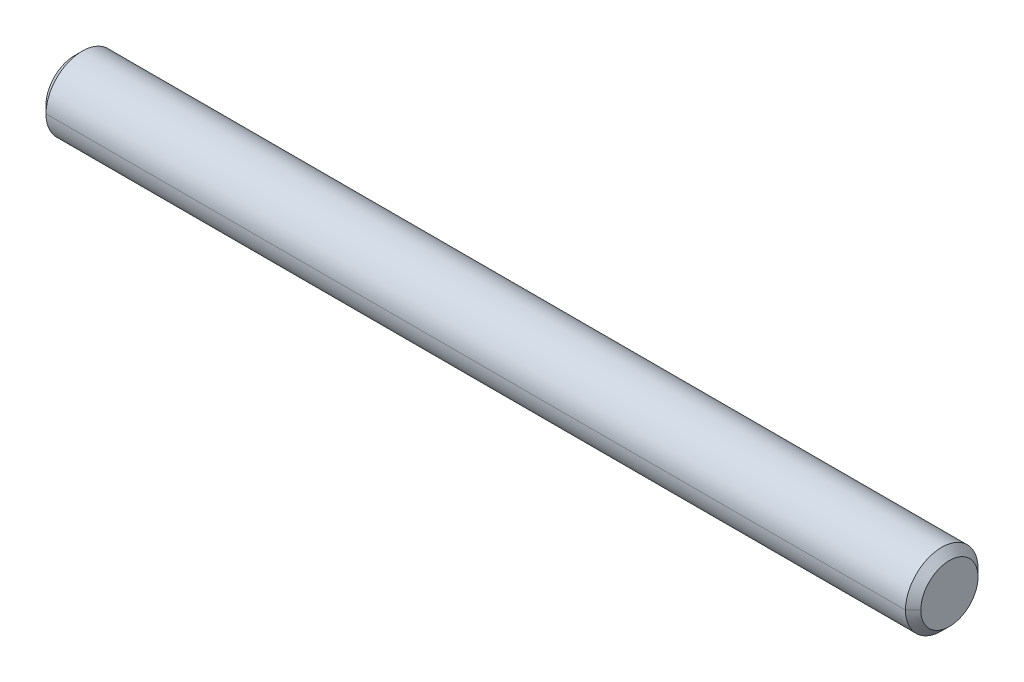
ISO-10303-21;
HEADER;
FILE_DESCRIPTION(('STEP AP214'),'2;1');
FILE_NAME('part.step','',(''),(''),'','','');
FILE_SCHEMA(('AUTOMOTIVE_DESIGN { 1 0 10303 214 1 1 1 1 }'));
ENDSEC;
DATA;
#1=APPLICATION_CONTEXT('core data for automotive mechanical design processes');
#2=APPLICATION_PROTOCOL_DEFINITION('international standard','automotive_design',2000,#1);
#3=PRODUCT_CONTEXT('',#1,'mechanical');
#4=PRODUCT('Part','Part','',(#3));
#5=PRODUCT_RELATED_PRODUCT_CATEGORY('part','',(#4));
#6=PRODUCT_DEFINITION_FORMATION('','',#4);
#7=PRODUCT_DEFINITION_CONTEXT('part definition',#1,'design');
#8=PRODUCT_DEFINITION('design','',#6,#7);
#9=PRODUCT_DEFINITION_SHAPE('','',#8);
#10=(LENGTH_UNIT() NAMED_UNIT(*) SI_UNIT(.MILLI.,.METRE.));
#11=(NAMED_UNIT(*) PLANE_ANGLE_UNIT() SI_UNIT($,.RADIAN.));
#12=(NAMED_UNIT(*) SI_UNIT($,.STERADIAN.) SOLID_ANGLE_UNIT());
#13=UNCERTAINTY_MEASURE_WITH_UNIT(LENGTH_MEASURE(1.E-05),#10,'distance_accuracy_value','');
#14=(GEOMETRIC_REPRESENTATION_CONTEXT(3) GLOBAL_UNCERTAINTY_ASSIGNED_CONTEXT((#13)) GLOBAL_UNIT_ASSIGNED_CONTEXT((#10,
#11,#12)) REPRESENTATION_CONTEXT('',''));
#15=CARTESIAN_POINT('',(0.,0.,0.));
#16=DIRECTION('',(0.,0.,1.));
#17=DIRECTION('',(1.,0.,0.));
#18=AXIS2_PLACEMENT_3D('',#15,#16,#17);
#19=CARTESIAN_POINT('',(28.575,0.,0.));
#20=DIRECTION('',(-1.,0.,0.));
#21=DIRECTION('',(0.,0.,1.));
#22=AXIS2_PLACEMENT_3D('',#19,#20,#21);
#23=CONICAL_SURFACE('',#22,1.86855,0.785398163397455);
#24=DIRECTION('',(-0.707106781186543,0.,-0.707106781186552));
#25=VECTOR('',#24,1.);
#26=CARTESIAN_POINT('',(28.575,0.,-1.86855));
#27=LINE('',#26,#25);
#28=CARTESIAN_POINT('',(28.575,0.,-1.86855));
#29=VERTEX_POINT('',#28);
#30=CARTESIAN_POINT('',(28.075,0.,-2.36855));
#31=VERTEX_POINT('',#30);
#32=EDGE_CURVE('E118',#29,#31,#27,.T.);
#33=ORIENTED_EDGE('',*,*,#32,.F.);
#34=CARTESIAN_POINT('',(28.575,0.,0.));
#35=DIRECTION('',(1.,0.,0.));
#36=DIRECTION('',(0.,0.,-1.));
#37=AXIS2_PLACEMENT_3D('',#34,#35,#36);
#38=CIRCLE('',#37,1.86855);
#39=CARTESIAN_POINT('',(28.575,0.,1.86855));
#40=VERTEX_POINT('',#39);
#41=EDGE_CURVE('E20',#40,#29,#38,.T.);
#42=ORIENTED_EDGE('',*,*,#41,.F.);
#43=DIRECTION('',(-0.707106781186543,0.,0.707106781186552));
#44=VECTOR('',#43,1.);
#45=CARTESIAN_POINT('',(28.575,0.,1.86855));
#46=LINE('',#45,#44);
#47=CARTESIAN_POINT('',(28.075,0.,2.36855));
#48=VERTEX_POINT('',#47);
#49=EDGE_CURVE('E88',#40,#48,#46,.T.);
#50=ORIENTED_EDGE('',*,*,#49,.T.);
#51=CARTESIAN_POINT('',(28.075,0.,0.));
#52=DIRECTION('',(-1.,0.,0.));
#53=DIRECTION('',(0.,0.,-1.));
#54=AXIS2_PLACEMENT_3D('',#51,#52,#53);
#55=CIRCLE('',#54,2.36855);
#56=EDGE_CURVE('E102',#31,#48,#55,.T.);
#57=ORIENTED_EDGE('',*,*,#56,.F.);
#58=EDGE_LOOP('',(#33,#42,#50,#57));
#59=FACE_BOUND('',#58,.T.);
#60=ADVANCED_FACE('F16',(#59),#23,.T.);
#61=CARTESIAN_POINT('',(-28.075,0.,0.));
#62=DIRECTION('',(1.,0.,0.));
#63=DIRECTION('',(0.,0.,-1.));
#64=AXIS2_PLACEMENT_3D('',#61,#62,#63);
#65=CONICAL_SURFACE('',#64,2.36855,0.785398163397458);
#66=DIRECTION('',(0.707106781186541,0.,0.707106781186555));
#67=VECTOR('',#66,1.);
#68=CARTESIAN_POINT('',(-28.075,0.,2.36855));
#69=LINE('',#68,#67);
#70=CARTESIAN_POINT('',(-28.575,0.,1.86855));
#71=VERTEX_POINT('',#70);
#72=CARTESIAN_POINT('',(-28.075,0.,2.36855));
#73=VERTEX_POINT('',#72);
#74=EDGE_CURVE('E76',#71,#73,#69,.T.);
#75=ORIENTED_EDGE('',*,*,#74,.F.);
#76=CARTESIAN_POINT('',(-28.575,0.,0.));
#77=DIRECTION('',(-1.,0.,0.));
#78=DIRECTION('',(0.,0.,-1.));
#79=AXIS2_PLACEMENT_3D('',#76,#77,#78);
#80=CIRCLE('',#79,1.86855);
#81=CARTESIAN_POINT('',(-28.575,0.,-1.86855));
#82=VERTEX_POINT('',#81);
#83=EDGE_CURVE('E11',#82,#71,#80,.T.);
#84=ORIENTED_EDGE('',*,*,#83,.F.);
#85=DIRECTION('',(0.707106781186541,0.,-0.707106781186555));
#86=VECTOR('',#85,1.);
#87=CARTESIAN_POINT('',(-28.075,0.,-2.36855));
#88=LINE('',#87,#86);
#89=CARTESIAN_POINT('',(-28.075,0.,-2.36855));
#90=VERTEX_POINT('',#89);
#91=EDGE_CURVE('E73',#82,#90,#88,.T.);
#92=ORIENTED_EDGE('',*,*,#91,.T.);
#93=CARTESIAN_POINT('',(-28.075,0.,0.));
#94=DIRECTION('',(1.,0.,0.));
#95=DIRECTION('',(0.,0.,-1.));
#96=AXIS2_PLACEMENT_3D('',#93,#94,#95);
#97=CIRCLE('',#96,2.36855);
#98=EDGE_CURVE('E41',#73,#90,#97,.T.);
#99=ORIENTED_EDGE('',*,*,#98,.F.);
#100=EDGE_LOOP('',(#75,#84,#92,#99));
#101=FACE_BOUND('',#100,.T.);
#102=ADVANCED_FACE('F72',(#101),#65,.T.);
#103=CARTESIAN_POINT('',(-28.575,0.,0.));
#104=DIRECTION('',(1.,0.,0.));
#105=DIRECTION('',(0.,1.,0.));
#106=AXIS2_PLACEMENT_3D('',#103,#104,#105);
#107=PLANE('',#106);
#108=ORIENTED_EDGE('',*,*,#83,.T.);
#109=CARTESIAN_POINT('',(-28.575,0.,0.));
#110=DIRECTION('',(-1.,0.,0.));
#111=DIRECTION('',(0.,0.,-1.));
#112=AXIS2_PLACEMENT_3D('',#109,#110,#111);
#113=CIRCLE('',#112,1.86855);
#114=EDGE_CURVE('E80',#71,#82,#113,.T.);
#115=ORIENTED_EDGE('',*,*,#114,.T.);
#116=EDGE_LOOP('',(#108,#115));
#117=FACE_BOUND('',#116,.T.);
#118=ADVANCED_FACE('F86',(#117),#107,.F.);
#119=CARTESIAN_POINT('',(28.575,0.,0.));
#120=DIRECTION('',(1.,0.,0.));
#121=DIRECTION('',(0.,1.,0.));
#122=AXIS2_PLACEMENT_3D('',#119,#120,#121);
#123=PLANE('',#122);
#124=ORIENTED_EDGE('',*,*,#41,.T.);
#125=CARTESIAN_POINT('',(28.575,0.,0.));
#126=DIRECTION('',(1.,0.,0.));
#127=DIRECTION('',(0.,0.,-1.));
#128=AXIS2_PLACEMENT_3D('',#125,#126,#127);
#129=CIRCLE('',#128,1.86855);
#130=EDGE_CURVE('E115',#29,#40,#129,.T.);
#131=ORIENTED_EDGE('',*,*,#130,.T.);
#132=EDGE_LOOP('',(#124,#131));
#133=FACE_BOUND('',#132,.T.);
#134=ADVANCED_FACE('F140',(#133),#123,.T.);
#135=CARTESIAN_POINT('',(28.575,0.,0.));
#136=DIRECTION('',(-1.,0.,0.));
#137=DIRECTION('',(0.,0.,1.));
#138=AXIS2_PLACEMENT_3D('',#135,#136,#137);
#139=CYLINDRICAL_SURFACE('',#138,2.36855);
#140=DIRECTION('',(-1.,0.,0.));
#141=VECTOR('',#140,1.);
#142=CARTESIAN_POINT('',(28.575,0.,-2.36855));
#143=LINE('',#142,#141);
#144=EDGE_CURVE('E84',#31,#90,#143,.T.);
#145=ORIENTED_EDGE('',*,*,#144,.F.);
#146=ORIENTED_EDGE('',*,*,#56,.T.);
#147=DIRECTION('',(-1.,0.,0.));
#148=VECTOR('',#147,1.);
#149=CARTESIAN_POINT('',(28.575,0.,2.36855));
#150=LINE('',#149,#148);
#151=EDGE_CURVE('E107',#48,#73,#150,.T.);
#152=ORIENTED_EDGE('',*,*,#151,.T.);
#153=ORIENTED_EDGE('',*,*,#98,.T.);
#154=EDGE_LOOP('',(#145,#146,#152,#153));
#155=FACE_BOUND('',#154,.T.);
#156=ADVANCED_FACE('F138',(#155),#139,.T.);
#157=CARTESIAN_POINT('',(28.575,0.,0.));
#158=DIRECTION('',(-1.,0.,0.));
#159=DIRECTION('',(0.,0.,1.));
#160=AXIS2_PLACEMENT_3D('',#157,#158,#159);
#161=CYLINDRICAL_SURFACE('',#160,2.36855);
#162=CARTESIAN_POINT('',(28.075,0.,0.));
#163=DIRECTION('',(-1.,0.,0.));
#164=DIRECTION('',(0.,0.,-1.));
#165=AXIS2_PLACEMENT_3D('',#162,#163,#164);
#166=CIRCLE('',#165,2.36855);
#167=EDGE_CURVE('E98',#48,#31,#166,.T.);
#168=ORIENTED_EDGE('',*,*,#167,.T.);
#169=ORIENTED_EDGE('',*,*,#144,.T.);
#170=CARTESIAN_POINT('',(-28.075,0.,0.));
#171=DIRECTION('',(1.,0.,0.));
#172=DIRECTION('',(0.,0.,-1.));
#173=AXIS2_PLACEMENT_3D('',#170,#171,#172);
#174=CIRCLE('',#173,2.36855);
#175=EDGE_CURVE('E82',#90,#73,#174,.T.);
#176=ORIENTED_EDGE('',*,*,#175,.T.);
#177=ORIENTED_EDGE('',*,*,#151,.F.);
#178=EDGE_LOOP('',(#168,#169,#176,#177));
#179=FACE_BOUND('',#178,.T.);
#180=ADVANCED_FACE('F18',(#179),#161,.T.);
#181=CARTESIAN_POINT('',(-28.075,0.,0.));
#182=DIRECTION('',(1.,0.,0.));
#183=DIRECTION('',(0.,0.,-1.));
#184=AXIS2_PLACEMENT_3D('',#181,#182,#183);
#185=CONICAL_SURFACE('',#184,2.36855,0.785398163397458);
#186=ORIENTED_EDGE('',*,*,#114,.F.);
#187=ORIENTED_EDGE('',*,*,#74,.T.);
#188=ORIENTED_EDGE('',*,*,#175,.F.);
#189=ORIENTED_EDGE('',*,*,#91,.F.);
#190=EDGE_LOOP('',(#186,#187,#188,#189));
#191=FACE_BOUND('',#190,.T.);
#192=ADVANCED_FACE('F79',(#191),#185,.T.);
#193=CARTESIAN_POINT('',(28.575,0.,0.));
#194=DIRECTION('',(-1.,0.,0.));
#195=DIRECTION('',(0.,0.,1.));
#196=AXIS2_PLACEMENT_3D('',#193,#194,#195);
#197=CONICAL_SURFACE('',#196,1.86855,0.785398163397455);
#198=ORIENTED_EDGE('',*,*,#130,.F.);
#199=ORIENTED_EDGE('',*,*,#32,.T.);
#200=ORIENTED_EDGE('',*,*,#167,.F.);
#201=ORIENTED_EDGE('',*,*,#49,.F.);
#202=EDGE_LOOP('',(#198,#199,#200,#201));
#203=FACE_BOUND('',#202,.T.);
#204=ADVANCED_FACE('F156',(#203),#197,.T.);
#205=CLOSED_SHELL('',(#60,#102,#118,#134,#156,#180,#192,#204));
#206=MANIFOLD_SOLID_BREP('B1',#205);
#207=ADVANCED_BREP_SHAPE_REPRESENTATION('',(#18,#206),#14);
#208=SHAPE_DEFINITION_REPRESENTATION(#9,#207);
ENDSEC;
END-ISO-10303-21;
